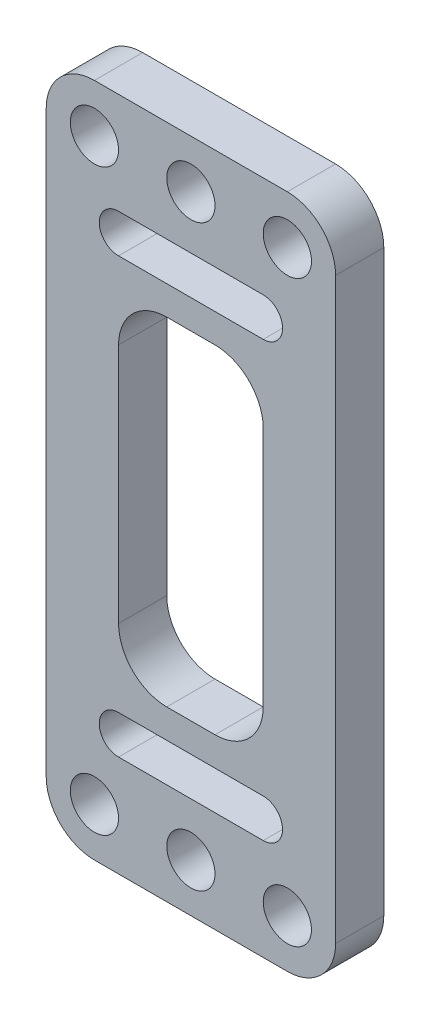
ISO-10303-21;
HEADER;
FILE_DESCRIPTION(('STEP AP214'),'2;1');
FILE_NAME('part.step','',(''),(''),'','','');
FILE_SCHEMA(('AUTOMOTIVE_DESIGN { 1 0 10303 214 1 1 1 1 }'));
ENDSEC;
DATA;
#1=APPLICATION_CONTEXT('core data for automotive mechanical design processes');
#2=APPLICATION_PROTOCOL_DEFINITION('international standard','automotive_design',2000,#1);
#3=PRODUCT_CONTEXT('',#1,'mechanical');
#4=PRODUCT('Part','Part','',(#3));
#5=PRODUCT_RELATED_PRODUCT_CATEGORY('part','',(#4));
#6=PRODUCT_DEFINITION_FORMATION('','',#4);
#7=PRODUCT_DEFINITION_CONTEXT('part definition',#1,'design');
#8=PRODUCT_DEFINITION('design','',#6,#7);
#9=PRODUCT_DEFINITION_SHAPE('','',#8);
#10=(LENGTH_UNIT() NAMED_UNIT(*) SI_UNIT(.MILLI.,.METRE.));
#11=(NAMED_UNIT(*) PLANE_ANGLE_UNIT() SI_UNIT($,.RADIAN.));
#12=(NAMED_UNIT(*) SI_UNIT($,.STERADIAN.) SOLID_ANGLE_UNIT());
#13=UNCERTAINTY_MEASURE_WITH_UNIT(LENGTH_MEASURE(1.E-05),#10,'distance_accuracy_value','');
#14=(GEOMETRIC_REPRESENTATION_CONTEXT(3) GLOBAL_UNCERTAINTY_ASSIGNED_CONTEXT((#13)) GLOBAL_UNIT_ASSIGNED_CONTEXT((#10,
#11,#12)) REPRESENTATION_CONTEXT('',''));
#15=CARTESIAN_POINT('',(0.,0.,0.));
#16=DIRECTION('',(0.,0.,1.));
#17=DIRECTION('',(1.,0.,0.));
#18=AXIS2_PLACEMENT_3D('',#15,#16,#17);
#19=CARTESIAN_POINT('',(0.,0.,5.));
#20=DIRECTION('',(0.,0.,-1.));
#21=DIRECTION('',(-1.,0.,0.));
#22=AXIS2_PLACEMENT_3D('',#19,#20,#21);
#23=PLANE('',#22);
#24=DIRECTION('',(1.,0.,0.));
#25=VECTOR('',#24,1.);
#26=CARTESIAN_POINT('',(-7.5,20.5,5.));
#27=LINE('',#26,#25);
#28=CARTESIAN_POINT('',(-7.5,20.5,5.));
#29=VERTEX_POINT('',#28);
#30=CARTESIAN_POINT('',(7.5,20.5,5.));
#31=VERTEX_POINT('',#30);
#32=EDGE_CURVE('E229',#29,#31,#27,.T.);
#33=ORIENTED_EDGE('',*,*,#32,.F.);
#34=CARTESIAN_POINT('',(-7.5,22.5,5.));
#35=DIRECTION('',(0.,0.,1.));
#36=DIRECTION('',(1.,0.,0.));
#37=AXIS2_PLACEMENT_3D('',#34,#35,#36);
#38=CIRCLE('',#37,2.00000000000001);
#39=CARTESIAN_POINT('',(-7.5,24.5,5.));
#40=VERTEX_POINT('',#39);
#41=EDGE_CURVE('E202',#40,#29,#38,.T.);
#42=ORIENTED_EDGE('',*,*,#41,.F.);
#43=DIRECTION('',(-1.,0.,0.));
#44=VECTOR('',#43,1.);
#45=CARTESIAN_POINT('',(-7.5,24.5,5.));
#46=LINE('',#45,#44);
#47=CARTESIAN_POINT('',(7.5,24.5,5.));
#48=VERTEX_POINT('',#47);
#49=EDGE_CURVE('E220',#48,#40,#46,.T.);
#50=ORIENTED_EDGE('',*,*,#49,.F.);
#51=CARTESIAN_POINT('',(7.5,22.5,5.));
#52=DIRECTION('',(0.,0.,1.));
#53=DIRECTION('',(1.,0.,0.));
#54=AXIS2_PLACEMENT_3D('',#51,#52,#53);
#55=CIRCLE('',#54,2.00000000000001);
#56=EDGE_CURVE('E223',#31,#48,#55,.T.);
#57=ORIENTED_EDGE('',*,*,#56,.F.);
#58=EDGE_LOOP('',(#33,#42,#50,#57));
#59=FACE_BOUND('',#58,.T.);
#60=DIRECTION('',(1.,0.,0.));
#61=VECTOR('',#60,1.);
#62=CARTESIAN_POINT('',(-7.50000000000001,-24.5,5.));
#63=LINE('',#62,#61);
#64=CARTESIAN_POINT('',(-7.50000000000001,-24.5,5.));
#65=VERTEX_POINT('',#64);
#66=CARTESIAN_POINT('',(7.49999999999999,-24.5,5.));
#67=VERTEX_POINT('',#66);
#68=EDGE_CURVE('E256',#65,#67,#63,.T.);
#69=ORIENTED_EDGE('',*,*,#68,.F.);
#70=CARTESIAN_POINT('',(-7.50000000000001,-22.5,5.));
#71=DIRECTION('',(0.,0.,1.));
#72=DIRECTION('',(-1.,0.,0.));
#73=AXIS2_PLACEMENT_3D('',#70,#71,#72);
#74=CIRCLE('',#73,2.00000000000001);
#75=CARTESIAN_POINT('',(-7.50000000000001,-20.5,5.));
#76=VERTEX_POINT('',#75);
#77=EDGE_CURVE('E254',#76,#65,#74,.T.);
#78=ORIENTED_EDGE('',*,*,#77,.F.);
#79=DIRECTION('',(-1.,0.,0.));
#80=VECTOR('',#79,1.);
#81=CARTESIAN_POINT('',(-7.50000000000001,-20.5,5.));
#82=LINE('',#81,#80);
#83=CARTESIAN_POINT('',(7.49999999999999,-20.5,5.));
#84=VERTEX_POINT('',#83);
#85=EDGE_CURVE('E244',#84,#76,#82,.T.);
#86=ORIENTED_EDGE('',*,*,#85,.F.);
#87=CARTESIAN_POINT('',(7.49999999999999,-22.5,5.));
#88=DIRECTION('',(0.,0.,1.));
#89=DIRECTION('',(-1.,0.,0.));
#90=AXIS2_PLACEMENT_3D('',#87,#88,#89);
#91=CIRCLE('',#90,2.00000000000001);
#92=EDGE_CURVE('E259',#67,#84,#91,.T.);
#93=ORIENTED_EDGE('',*,*,#92,.F.);
#94=EDGE_LOOP('',(#69,#78,#86,#93));
#95=FACE_BOUND('',#94,.T.);
#96=DIRECTION('',(-1.,0.,0.));
#97=VECTOR('',#96,1.);
#98=CARTESIAN_POINT('',(-7.5,17.5,5.));
#99=LINE('',#98,#97);
#100=CARTESIAN_POINT('',(2.5,17.5,5.));
#101=VERTEX_POINT('',#100);
#102=CARTESIAN_POINT('',(-2.5,17.5,5.));
#103=VERTEX_POINT('',#102);
#104=EDGE_CURVE('E285',#101,#103,#99,.T.);
#105=ORIENTED_EDGE('',*,*,#104,.F.);
#106=CARTESIAN_POINT('',(2.5,12.5,5.));
#107=DIRECTION('',(0.,0.,-1.));
#108=DIRECTION('',(-1.,0.,0.));
#109=AXIS2_PLACEMENT_3D('',#106,#107,#108);
#110=CIRCLE('',#109,5.);
#111=CARTESIAN_POINT('',(7.5,12.5,5.));
#112=VERTEX_POINT('',#111);
#113=EDGE_CURVE('E414',#101,#112,#110,.T.);
#114=ORIENTED_EDGE('',*,*,#113,.T.);
#115=DIRECTION('',(0.,1.,0.));
#116=VECTOR('',#115,1.);
#117=CARTESIAN_POINT('',(7.5,-17.5,5.));
#118=LINE('',#117,#116);
#119=CARTESIAN_POINT('',(7.5,-12.5,5.));
#120=VERTEX_POINT('',#119);
#121=EDGE_CURVE('E236',#120,#112,#118,.T.);
#122=ORIENTED_EDGE('',*,*,#121,.F.);
#123=CARTESIAN_POINT('',(2.5,-12.5,5.));
#124=DIRECTION('',(0.,0.,-1.));
#125=DIRECTION('',(-1.,0.,0.));
#126=AXIS2_PLACEMENT_3D('',#123,#124,#125);
#127=CIRCLE('',#126,5.);
#128=CARTESIAN_POINT('',(2.5,-17.5,5.));
#129=VERTEX_POINT('',#128);
#130=EDGE_CURVE('E406',#120,#129,#127,.T.);
#131=ORIENTED_EDGE('',*,*,#130,.T.);
#132=DIRECTION('',(1.,0.,0.));
#133=VECTOR('',#132,1.);
#134=CARTESIAN_POINT('',(-7.5,-17.5,5.));
#135=LINE('',#134,#133);
#136=CARTESIAN_POINT('',(-2.5,-17.5,5.));
#137=VERTEX_POINT('',#136);
#138=EDGE_CURVE('E274',#137,#129,#135,.T.);
#139=ORIENTED_EDGE('',*,*,#138,.F.);
#140=CARTESIAN_POINT('',(-2.5,-12.5,5.));
#141=DIRECTION('',(0.,0.,-1.));
#142=DIRECTION('',(-1.,0.,0.));
#143=AXIS2_PLACEMENT_3D('',#140,#141,#142);
#144=CIRCLE('',#143,5.);
#145=CARTESIAN_POINT('',(-7.5,-12.5,5.));
#146=VERTEX_POINT('',#145);
#147=EDGE_CURVE('E410',#137,#146,#144,.T.);
#148=ORIENTED_EDGE('',*,*,#147,.T.);
#149=DIRECTION('',(0.,-1.,0.));
#150=VECTOR('',#149,1.);
#151=CARTESIAN_POINT('',(-7.5,-17.5,5.));
#152=LINE('',#151,#150);
#153=CARTESIAN_POINT('',(-7.5,12.5,5.));
#154=VERTEX_POINT('',#153);
#155=EDGE_CURVE('E287',#154,#146,#152,.T.);
#156=ORIENTED_EDGE('',*,*,#155,.F.);
#157=CARTESIAN_POINT('',(-2.5,12.5,5.));
#158=DIRECTION('',(0.,0.,-1.));
#159=DIRECTION('',(-1.,0.,0.));
#160=AXIS2_PLACEMENT_3D('',#157,#158,#159);
#161=CIRCLE('',#160,5.);
#162=EDGE_CURVE('E41',#154,#103,#161,.T.);
#163=ORIENTED_EDGE('',*,*,#162,.T.);
#164=EDGE_LOOP('',(#105,#114,#122,#131,#139,#148,#156,#163));
#165=FACE_BOUND('',#164,.T.);
#166=DIRECTION('',(1.,0.,0.));
#167=VECTOR('',#166,1.);
#168=CARTESIAN_POINT('',(-15.,-35.,5.));
#169=LINE('',#168,#167);
#170=CARTESIAN_POINT('',(-10.,-35.,5.));
#171=VERTEX_POINT('',#170);
#172=CARTESIAN_POINT('',(9.99999999999998,-35.,5.));
#173=VERTEX_POINT('',#172);
#174=EDGE_CURVE('E338',#171,#173,#169,.T.);
#175=ORIENTED_EDGE('',*,*,#174,.T.);
#176=CARTESIAN_POINT('',(9.99999999999999,-30.,5.));
#177=DIRECTION('',(0.,0.,-1.));
#178=DIRECTION('',(-1.,0.,0.));
#179=AXIS2_PLACEMENT_3D('',#176,#177,#178);
#180=CIRCLE('',#179,5.);
#181=CARTESIAN_POINT('',(15.,-30.,5.));
#182=VERTEX_POINT('',#181);
#183=EDGE_CURVE('E375',#173,#182,#180,.F.);
#184=ORIENTED_EDGE('',*,*,#183,.T.);
#185=DIRECTION('',(0.,1.,0.));
#186=VECTOR('',#185,1.);
#187=CARTESIAN_POINT('',(15.,-35.,5.));
#188=LINE('',#187,#186);
#189=CARTESIAN_POINT('',(15.,30.,5.));
#190=VERTEX_POINT('',#189);
#191=EDGE_CURVE('E328',#182,#190,#188,.T.);
#192=ORIENTED_EDGE('',*,*,#191,.T.);
#193=CARTESIAN_POINT('',(9.99999999999999,30.,5.));
#194=DIRECTION('',(0.,0.,-1.));
#195=DIRECTION('',(-1.,0.,0.));
#196=AXIS2_PLACEMENT_3D('',#193,#194,#195);
#197=CIRCLE('',#196,5.);
#198=CARTESIAN_POINT('',(9.99999999999998,35.,5.));
#199=VERTEX_POINT('',#198);
#200=EDGE_CURVE('E371',#190,#199,#197,.F.);
#201=ORIENTED_EDGE('',*,*,#200,.T.);
#202=DIRECTION('',(-1.,0.,0.));
#203=VECTOR('',#202,1.);
#204=CARTESIAN_POINT('',(-15.,35.,5.));
#205=LINE('',#204,#203);
#206=CARTESIAN_POINT('',(-10.,35.,5.));
#207=VERTEX_POINT('',#206);
#208=EDGE_CURVE('E331',#199,#207,#205,.T.);
#209=ORIENTED_EDGE('',*,*,#208,.T.);
#210=CARTESIAN_POINT('',(-10.,30.,5.));
#211=DIRECTION('',(0.,0.,-1.));
#212=DIRECTION('',(-1.,0.,0.));
#213=AXIS2_PLACEMENT_3D('',#210,#211,#212);
#214=CIRCLE('',#213,5.);
#215=CARTESIAN_POINT('',(-15.,30.,5.));
#216=VERTEX_POINT('',#215);
#217=EDGE_CURVE('E369',#207,#216,#214,.F.);
#218=ORIENTED_EDGE('',*,*,#217,.T.);
#219=DIRECTION('',(0.,-1.,0.));
#220=VECTOR('',#219,1.);
#221=CARTESIAN_POINT('',(-15.,-35.,5.));
#222=LINE('',#221,#220);
#223=CARTESIAN_POINT('',(-15.,-30.,5.));
#224=VERTEX_POINT('',#223);
#225=EDGE_CURVE('E335',#216,#224,#222,.T.);
#226=ORIENTED_EDGE('',*,*,#225,.T.);
#227=CARTESIAN_POINT('',(-10.,-30.,5.));
#228=DIRECTION('',(0.,0.,-1.));
#229=DIRECTION('',(-1.,0.,0.));
#230=AXIS2_PLACEMENT_3D('',#227,#228,#229);
#231=CIRCLE('',#230,5.);
#232=EDGE_CURVE('E373',#224,#171,#231,.F.);
#233=ORIENTED_EDGE('',*,*,#232,.T.);
#234=EDGE_LOOP('',(#175,#184,#192,#201,#209,#218,#226,#233));
#235=FACE_BOUND('',#234,.T.);
#236=CARTESIAN_POINT('',(0.,30.,5.));
#237=DIRECTION('',(0.,0.,1.));
#238=DIRECTION('',(1.,0.,0.));
#239=AXIS2_PLACEMENT_3D('',#236,#237,#238);
#240=CIRCLE('',#239,2.5);
#241=CARTESIAN_POINT('',(2.49999999999999,30.,5.));
#242=VERTEX_POINT('',#241);
#243=EDGE_CURVE('E322',#242,#242,#240,.T.);
#244=ORIENTED_EDGE('',*,*,#243,.F.);
#245=EDGE_LOOP('',(#244));
#246=FACE_BOUND('',#245,.T.);
#247=CARTESIAN_POINT('',(9.99999999999999,30.,5.));
#248=DIRECTION('',(0.,0.,1.));
#249=DIRECTION('',(1.,0.,0.));
#250=AXIS2_PLACEMENT_3D('',#247,#248,#249);
#251=CIRCLE('',#250,2.5);
#252=CARTESIAN_POINT('',(12.5,30.,5.));
#253=VERTEX_POINT('',#252);
#254=EDGE_CURVE('E316',#253,#253,#251,.T.);
#255=ORIENTED_EDGE('',*,*,#254,.F.);
#256=EDGE_LOOP('',(#255));
#257=FACE_BOUND('',#256,.T.);
#258=CARTESIAN_POINT('',(-10.,30.,5.));
#259=DIRECTION('',(0.,0.,1.));
#260=DIRECTION('',(-1.,0.,0.));
#261=AXIS2_PLACEMENT_3D('',#258,#259,#260);
#262=CIRCLE('',#261,2.5);
#263=CARTESIAN_POINT('',(-12.5,30.,5.));
#264=VERTEX_POINT('',#263);
#265=EDGE_CURVE('E310',#264,#264,#262,.T.);
#266=ORIENTED_EDGE('',*,*,#265,.F.);
#267=EDGE_LOOP('',(#266));
#268=FACE_BOUND('',#267,.T.);
#269=CARTESIAN_POINT('',(9.99999999999999,-30.,5.));
#270=DIRECTION('',(0.,0.,1.));
#271=DIRECTION('',(-1.,0.,0.));
#272=AXIS2_PLACEMENT_3D('',#269,#270,#271);
#273=CIRCLE('',#272,2.5);
#274=CARTESIAN_POINT('',(7.49999999999999,-30.,5.));
#275=VERTEX_POINT('',#274);
#276=EDGE_CURVE('E304',#275,#275,#273,.T.);
#277=ORIENTED_EDGE('',*,*,#276,.F.);
#278=EDGE_LOOP('',(#277));
#279=FACE_BOUND('',#278,.T.);
#280=CARTESIAN_POINT('',(0.,-30.,5.));
#281=DIRECTION('',(0.,0.,1.));
#282=DIRECTION('',(-1.,0.,0.));
#283=AXIS2_PLACEMENT_3D('',#280,#281,#282);
#284=CIRCLE('',#283,2.5);
#285=CARTESIAN_POINT('',(-2.5,-30.,5.));
#286=VERTEX_POINT('',#285);
#287=EDGE_CURVE('E298',#286,#286,#284,.T.);
#288=ORIENTED_EDGE('',*,*,#287,.F.);
#289=EDGE_LOOP('',(#288));
#290=FACE_BOUND('',#289,.T.);
#291=CARTESIAN_POINT('',(-10.,-30.,5.));
#292=DIRECTION('',(0.,0.,1.));
#293=DIRECTION('',(1.,0.,0.));
#294=AXIS2_PLACEMENT_3D('',#291,#292,#293);
#295=CIRCLE('',#294,2.5);
#296=CARTESIAN_POINT('',(-7.5,-30.,5.));
#297=VERTEX_POINT('',#296);
#298=EDGE_CURVE('E292',#297,#297,#295,.T.);
#299=ORIENTED_EDGE('',*,*,#298,.F.);
#300=EDGE_LOOP('',(#299));
#301=FACE_BOUND('',#300,.T.);
#302=ADVANCED_FACE('F33',(#59,#95,#165,#235,#246,#257,#268,#279,#290,#301),#23,.F.);
#303=CARTESIAN_POINT('',(0.,0.,0.));
#304=DIRECTION('',(0.,0.,-1.));
#305=DIRECTION('',(-1.,0.,0.));
#306=AXIS2_PLACEMENT_3D('',#303,#304,#305);
#307=PLANE('',#306);
#308=CARTESIAN_POINT('',(-7.5,22.5,0.));
#309=DIRECTION('',(0.,0.,1.));
#310=DIRECTION('',(1.,0.,0.));
#311=AXIS2_PLACEMENT_3D('',#308,#309,#310);
#312=CIRCLE('',#311,2.00000000000001);
#313=CARTESIAN_POINT('',(-7.5,24.5,0.));
#314=VERTEX_POINT('',#313);
#315=CARTESIAN_POINT('',(-7.5,20.5,0.));
#316=VERTEX_POINT('',#315);
#317=EDGE_CURVE('E199',#314,#316,#312,.T.);
#318=ORIENTED_EDGE('',*,*,#317,.T.);
#319=DIRECTION('',(1.,0.,0.));
#320=VECTOR('',#319,1.);
#321=CARTESIAN_POINT('',(-7.5,20.5,0.));
#322=LINE('',#321,#320);
#323=CARTESIAN_POINT('',(7.5,20.5,0.));
#324=VERTEX_POINT('',#323);
#325=EDGE_CURVE('E211',#316,#324,#322,.T.);
#326=ORIENTED_EDGE('',*,*,#325,.T.);
#327=CARTESIAN_POINT('',(7.5,22.5,0.));
#328=DIRECTION('',(0.,0.,1.));
#329=DIRECTION('',(1.,0.,0.));
#330=AXIS2_PLACEMENT_3D('',#327,#328,#329);
#331=CIRCLE('',#330,2.00000000000001);
#332=CARTESIAN_POINT('',(7.5,24.5,0.));
#333=VERTEX_POINT('',#332);
#334=EDGE_CURVE('E215',#324,#333,#331,.T.);
#335=ORIENTED_EDGE('',*,*,#334,.T.);
#336=DIRECTION('',(-1.,0.,0.));
#337=VECTOR('',#336,1.);
#338=CARTESIAN_POINT('',(-7.5,24.5,0.));
#339=LINE('',#338,#337);
#340=EDGE_CURVE('E207',#333,#314,#339,.T.);
#341=ORIENTED_EDGE('',*,*,#340,.T.);
#342=EDGE_LOOP('',(#318,#326,#335,#341));
#343=FACE_BOUND('',#342,.T.);
#344=CARTESIAN_POINT('',(-7.50000000000001,-22.5,0.));
#345=DIRECTION('',(0.,0.,1.));
#346=DIRECTION('',(-1.,0.,0.));
#347=AXIS2_PLACEMENT_3D('',#344,#345,#346);
#348=CIRCLE('',#347,2.00000000000001);
#349=CARTESIAN_POINT('',(-7.50000000000001,-20.5,0.));
#350=VERTEX_POINT('',#349);
#351=CARTESIAN_POINT('',(-7.50000000000001,-24.5,0.));
#352=VERTEX_POINT('',#351);
#353=EDGE_CURVE('E240',#350,#352,#348,.T.);
#354=ORIENTED_EDGE('',*,*,#353,.T.);
#355=DIRECTION('',(1.,0.,0.));
#356=VECTOR('',#355,1.);
#357=CARTESIAN_POINT('',(-7.50000000000001,-24.5,0.));
#358=LINE('',#357,#356);
#359=CARTESIAN_POINT('',(7.49999999999999,-24.5,0.));
#360=VERTEX_POINT('',#359);
#361=EDGE_CURVE('E243',#352,#360,#358,.T.);
#362=ORIENTED_EDGE('',*,*,#361,.T.);
#363=CARTESIAN_POINT('',(7.49999999999999,-22.5,0.));
#364=DIRECTION('',(0.,0.,1.));
#365=DIRECTION('',(-1.,0.,0.));
#366=AXIS2_PLACEMENT_3D('',#363,#364,#365);
#367=CIRCLE('',#366,2.00000000000001);
#368=CARTESIAN_POINT('',(7.49999999999999,-20.5,0.));
#369=VERTEX_POINT('',#368);
#370=EDGE_CURVE('E247',#360,#369,#367,.T.);
#371=ORIENTED_EDGE('',*,*,#370,.T.);
#372=DIRECTION('',(-1.,0.,0.));
#373=VECTOR('',#372,1.);
#374=CARTESIAN_POINT('',(-7.50000000000001,-20.5,0.));
#375=LINE('',#374,#373);
#376=EDGE_CURVE('E250',#369,#350,#375,.T.);
#377=ORIENTED_EDGE('',*,*,#376,.T.);
#378=EDGE_LOOP('',(#354,#362,#371,#377));
#379=FACE_BOUND('',#378,.T.);
#380=DIRECTION('',(1.,0.,0.));
#381=VECTOR('',#380,1.);
#382=CARTESIAN_POINT('',(-7.5,-17.5,0.));
#383=LINE('',#382,#381);
#384=CARTESIAN_POINT('',(-2.5,-17.5,0.));
#385=VERTEX_POINT('',#384);
#386=CARTESIAN_POINT('',(2.5,-17.5,0.));
#387=VERTEX_POINT('',#386);
#388=EDGE_CURVE('E279',#385,#387,#383,.T.);
#389=ORIENTED_EDGE('',*,*,#388,.T.);
#390=CARTESIAN_POINT('',(2.5,-12.5,0.));
#391=DIRECTION('',(0.,0.,-1.));
#392=DIRECTION('',(-1.,0.,0.));
#393=AXIS2_PLACEMENT_3D('',#390,#391,#392);
#394=CIRCLE('',#393,5.);
#395=CARTESIAN_POINT('',(7.5,-12.5,0.));
#396=VERTEX_POINT('',#395);
#397=EDGE_CURVE('E408',#387,#396,#394,.F.);
#398=ORIENTED_EDGE('',*,*,#397,.T.);
#399=DIRECTION('',(0.,1.,0.));
#400=VECTOR('',#399,1.);
#401=CARTESIAN_POINT('',(7.5,-17.5,0.));
#402=LINE('',#401,#400);
#403=CARTESIAN_POINT('',(7.5,12.5,0.));
#404=VERTEX_POINT('',#403);
#405=EDGE_CURVE('E271',#396,#404,#402,.T.);
#406=ORIENTED_EDGE('',*,*,#405,.T.);
#407=CARTESIAN_POINT('',(2.5,12.5,0.));
#408=DIRECTION('',(0.,0.,-1.));
#409=DIRECTION('',(-1.,0.,0.));
#410=AXIS2_PLACEMENT_3D('',#407,#408,#409);
#411=CIRCLE('',#410,5.);
#412=CARTESIAN_POINT('',(2.5,17.5,0.));
#413=VERTEX_POINT('',#412);
#414=EDGE_CURVE('E55',#404,#413,#411,.F.);
#415=ORIENTED_EDGE('',*,*,#414,.T.);
#416=DIRECTION('',(-1.,0.,0.));
#417=VECTOR('',#416,1.);
#418=CARTESIAN_POINT('',(-7.5,17.5,0.));
#419=LINE('',#418,#417);
#420=CARTESIAN_POINT('',(-2.5,17.5,0.));
#421=VERTEX_POINT('',#420);
#422=EDGE_CURVE('E273',#413,#421,#419,.T.);
#423=ORIENTED_EDGE('',*,*,#422,.T.);
#424=CARTESIAN_POINT('',(-2.5,12.5,0.));
#425=DIRECTION('',(0.,0.,-1.));
#426=DIRECTION('',(-1.,0.,0.));
#427=AXIS2_PLACEMENT_3D('',#424,#425,#426);
#428=CIRCLE('',#427,5.);
#429=CARTESIAN_POINT('',(-7.5,12.5,0.));
#430=VERTEX_POINT('',#429);
#431=EDGE_CURVE('E11',#421,#430,#428,.F.);
#432=ORIENTED_EDGE('',*,*,#431,.T.);
#433=DIRECTION('',(0.,-1.,0.));
#434=VECTOR('',#433,1.);
#435=CARTESIAN_POINT('',(-7.5,-17.5,0.));
#436=LINE('',#435,#434);
#437=CARTESIAN_POINT('',(-7.5,-12.5,0.));
#438=VERTEX_POINT('',#437);
#439=EDGE_CURVE('E276',#430,#438,#436,.T.);
#440=ORIENTED_EDGE('',*,*,#439,.T.);
#441=CARTESIAN_POINT('',(-2.5,-12.5,0.));
#442=DIRECTION('',(0.,0.,-1.));
#443=DIRECTION('',(-1.,0.,0.));
#444=AXIS2_PLACEMENT_3D('',#441,#442,#443);
#445=CIRCLE('',#444,5.);
#446=EDGE_CURVE('E412',#438,#385,#445,.F.);
#447=ORIENTED_EDGE('',*,*,#446,.T.);
#448=EDGE_LOOP('',(#389,#398,#406,#415,#423,#432,#440,#447));
#449=FACE_BOUND('',#448,.T.);
#450=CARTESIAN_POINT('',(0.,-30.,0.));
#451=DIRECTION('',(0.,0.,1.));
#452=DIRECTION('',(-1.,0.,0.));
#453=AXIS2_PLACEMENT_3D('',#450,#451,#452);
#454=CIRCLE('',#453,2.5);
#455=CARTESIAN_POINT('',(-2.5,-30.,0.));
#456=VERTEX_POINT('',#455);
#457=EDGE_CURVE('E295',#456,#456,#454,.T.);
#458=ORIENTED_EDGE('',*,*,#457,.T.);
#459=EDGE_LOOP('',(#458));
#460=FACE_BOUND('',#459,.T.);
#461=CARTESIAN_POINT('',(-10.,30.,0.));
#462=DIRECTION('',(0.,0.,1.));
#463=DIRECTION('',(-1.,0.,0.));
#464=AXIS2_PLACEMENT_3D('',#461,#462,#463);
#465=CIRCLE('',#464,2.5);
#466=CARTESIAN_POINT('',(-12.5,30.,0.));
#467=VERTEX_POINT('',#466);
#468=EDGE_CURVE('E307',#467,#467,#465,.T.);
#469=ORIENTED_EDGE('',*,*,#468,.T.);
#470=EDGE_LOOP('',(#469));
#471=FACE_BOUND('',#470,.T.);
#472=CARTESIAN_POINT('',(0.,30.,0.));
#473=DIRECTION('',(0.,0.,1.));
#474=DIRECTION('',(1.,0.,0.));
#475=AXIS2_PLACEMENT_3D('',#472,#473,#474);
#476=CIRCLE('',#475,2.5);
#477=CARTESIAN_POINT('',(2.49999999999999,30.,0.));
#478=VERTEX_POINT('',#477);
#479=EDGE_CURVE('E319',#478,#478,#476,.T.);
#480=ORIENTED_EDGE('',*,*,#479,.T.);
#481=EDGE_LOOP('',(#480));
#482=FACE_BOUND('',#481,.T.);
#483=DIRECTION('',(0.,1.,0.));
#484=VECTOR('',#483,1.);
#485=CARTESIAN_POINT('',(15.,-35.,0.));
#486=LINE('',#485,#484);
#487=CARTESIAN_POINT('',(15.,-30.,0.));
#488=VERTEX_POINT('',#487);
#489=CARTESIAN_POINT('',(15.,30.,0.));
#490=VERTEX_POINT('',#489);
#491=EDGE_CURVE('E325',#488,#490,#486,.T.);
#492=ORIENTED_EDGE('',*,*,#491,.F.);
#493=CARTESIAN_POINT('',(9.99999999999999,-30.,0.));
#494=DIRECTION('',(0.,0.,-1.));
#495=DIRECTION('',(-1.,0.,0.));
#496=AXIS2_PLACEMENT_3D('',#493,#494,#495);
#497=CIRCLE('',#496,5.);
#498=CARTESIAN_POINT('',(9.99999999999998,-35.,0.));
#499=VERTEX_POINT('',#498);
#500=EDGE_CURVE('E362',#488,#499,#497,.T.);
#501=ORIENTED_EDGE('',*,*,#500,.T.);
#502=DIRECTION('',(1.,0.,0.));
#503=VECTOR('',#502,1.);
#504=CARTESIAN_POINT('',(-15.,-35.,0.));
#505=LINE('',#504,#503);
#506=CARTESIAN_POINT('',(-10.,-35.,0.));
#507=VERTEX_POINT('',#506);
#508=EDGE_CURVE('E332',#507,#499,#505,.T.);
#509=ORIENTED_EDGE('',*,*,#508,.F.);
#510=CARTESIAN_POINT('',(-10.,-30.,0.));
#511=DIRECTION('',(0.,0.,-1.));
#512=DIRECTION('',(-1.,0.,0.));
#513=AXIS2_PLACEMENT_3D('',#510,#511,#512);
#514=CIRCLE('',#513,5.);
#515=CARTESIAN_POINT('',(-15.,-30.,0.));
#516=VERTEX_POINT('',#515);
#517=EDGE_CURVE('E360',#507,#516,#514,.T.);
#518=ORIENTED_EDGE('',*,*,#517,.T.);
#519=DIRECTION('',(0.,-1.,0.));
#520=VECTOR('',#519,1.);
#521=CARTESIAN_POINT('',(-15.,-35.,0.));
#522=LINE('',#521,#520);
#523=CARTESIAN_POINT('',(-15.,30.,0.));
#524=VERTEX_POINT('',#523);
#525=EDGE_CURVE('E347',#524,#516,#522,.T.);
#526=ORIENTED_EDGE('',*,*,#525,.F.);
#527=CARTESIAN_POINT('',(-10.,30.,0.));
#528=DIRECTION('',(0.,0.,-1.));
#529=DIRECTION('',(-1.,0.,0.));
#530=AXIS2_PLACEMENT_3D('',#527,#528,#529);
#531=CIRCLE('',#530,5.);
#532=CARTESIAN_POINT('',(-10.,35.,0.));
#533=VERTEX_POINT('',#532);
#534=EDGE_CURVE('E356',#524,#533,#531,.T.);
#535=ORIENTED_EDGE('',*,*,#534,.T.);
#536=DIRECTION('',(-1.,0.,0.));
#537=VECTOR('',#536,1.);
#538=CARTESIAN_POINT('',(-15.,35.,0.));
#539=LINE('',#538,#537);
#540=CARTESIAN_POINT('',(9.99999999999998,35.,0.));
#541=VERTEX_POINT('',#540);
#542=EDGE_CURVE('E344',#541,#533,#539,.T.);
#543=ORIENTED_EDGE('',*,*,#542,.F.);
#544=CARTESIAN_POINT('',(9.99999999999999,30.,0.));
#545=DIRECTION('',(0.,0.,-1.));
#546=DIRECTION('',(-1.,0.,0.));
#547=AXIS2_PLACEMENT_3D('',#544,#545,#546);
#548=CIRCLE('',#547,5.);
#549=EDGE_CURVE('E358',#541,#490,#548,.T.);
#550=ORIENTED_EDGE('',*,*,#549,.T.);
#551=EDGE_LOOP('',(#492,#501,#509,#518,#526,#535,#543,#550));
#552=FACE_BOUND('',#551,.T.);
#553=CARTESIAN_POINT('',(9.99999999999999,30.,0.));
#554=DIRECTION('',(0.,0.,1.));
#555=DIRECTION('',(1.,0.,0.));
#556=AXIS2_PLACEMENT_3D('',#553,#554,#555);
#557=CIRCLE('',#556,2.5);
#558=CARTESIAN_POINT('',(12.5,30.,0.));
#559=VERTEX_POINT('',#558);
#560=EDGE_CURVE('E313',#559,#559,#557,.T.);
#561=ORIENTED_EDGE('',*,*,#560,.T.);
#562=EDGE_LOOP('',(#561));
#563=FACE_BOUND('',#562,.T.);
#564=CARTESIAN_POINT('',(9.99999999999999,-30.,0.));
#565=DIRECTION('',(0.,0.,1.));
#566=DIRECTION('',(-1.,0.,0.));
#567=AXIS2_PLACEMENT_3D('',#564,#565,#566);
#568=CIRCLE('',#567,2.5);
#569=CARTESIAN_POINT('',(7.49999999999999,-30.,0.));
#570=VERTEX_POINT('',#569);
#571=EDGE_CURVE('E301',#570,#570,#568,.T.);
#572=ORIENTED_EDGE('',*,*,#571,.T.);
#573=EDGE_LOOP('',(#572));
#574=FACE_BOUND('',#573,.T.);
#575=CARTESIAN_POINT('',(-10.,-30.,0.));
#576=DIRECTION('',(0.,0.,1.));
#577=DIRECTION('',(1.,0.,0.));
#578=AXIS2_PLACEMENT_3D('',#575,#576,#577);
#579=CIRCLE('',#578,2.5);
#580=CARTESIAN_POINT('',(-7.5,-30.,0.));
#581=VERTEX_POINT('',#580);
#582=EDGE_CURVE('E282',#581,#581,#579,.T.);
#583=ORIENTED_EDGE('',*,*,#582,.T.);
#584=EDGE_LOOP('',(#583));
#585=FACE_BOUND('',#584,.T.);
#586=ADVANCED_FACE('F217',(#343,#379,#449,#460,#471,#482,#552,#563,#574,#585),#307,.T.);
#587=CARTESIAN_POINT('',(15.,-35.,5.));
#588=DIRECTION('',(-1.,0.,0.));
#589=DIRECTION('',(0.,0.,1.));
#590=AXIS2_PLACEMENT_3D('',#587,#588,#589);
#591=PLANE('',#590);
#592=ORIENTED_EDGE('',*,*,#191,.F.);
#593=DIRECTION('',(0.,0.,-1.));
#594=VECTOR('',#593,1.);
#595=CARTESIAN_POINT('',(15.,-30.,5.));
#596=LINE('',#595,#594);
#597=EDGE_CURVE('E353',#182,#488,#596,.T.);
#598=ORIENTED_EDGE('',*,*,#597,.T.);
#599=ORIENTED_EDGE('',*,*,#491,.T.);
#600=DIRECTION('',(0.,0.,-1.));
#601=VECTOR('',#600,1.);
#602=CARTESIAN_POINT('',(15.,30.,5.));
#603=LINE('',#602,#601);
#604=EDGE_CURVE('E341',#490,#190,#603,.F.);
#605=ORIENTED_EDGE('',*,*,#604,.T.);
#606=EDGE_LOOP('',(#592,#598,#599,#605));
#607=FACE_BOUND('',#606,.T.);
#608=ADVANCED_FACE('F462',(#607),#591,.F.);
#609=CARTESIAN_POINT('',(-15.,35.,5.));
#610=DIRECTION('',(0.,-1.,0.));
#611=DIRECTION('',(0.,0.,-1.));
#612=AXIS2_PLACEMENT_3D('',#609,#610,#611);
#613=PLANE('',#612);
#614=ORIENTED_EDGE('',*,*,#208,.F.);
#615=DIRECTION('',(0.,0.,-1.));
#616=VECTOR('',#615,1.);
#617=CARTESIAN_POINT('',(9.99999999999999,35.,5.));
#618=LINE('',#617,#616);
#619=EDGE_CURVE('E384',#199,#541,#618,.T.);
#620=ORIENTED_EDGE('',*,*,#619,.T.);
#621=ORIENTED_EDGE('',*,*,#542,.T.);
#622=DIRECTION('',(0.,0.,-1.));
#623=VECTOR('',#622,1.);
#624=CARTESIAN_POINT('',(-10.,35.,5.));
#625=LINE('',#624,#623);
#626=EDGE_CURVE('E382',#533,#207,#625,.F.);
#627=ORIENTED_EDGE('',*,*,#626,.T.);
#628=EDGE_LOOP('',(#614,#620,#621,#627));
#629=FACE_BOUND('',#628,.T.);
#630=ADVANCED_FACE('F476',(#629),#613,.F.);
#631=CARTESIAN_POINT('',(-15.,-35.,5.));
#632=DIRECTION('',(1.,0.,0.));
#633=DIRECTION('',(0.,0.,-1.));
#634=AXIS2_PLACEMENT_3D('',#631,#632,#633);
#635=PLANE('',#634);
#636=ORIENTED_EDGE('',*,*,#525,.T.);
#637=DIRECTION('',(0.,0.,-1.));
#638=VECTOR('',#637,1.);
#639=CARTESIAN_POINT('',(-15.,-30.,5.));
#640=LINE('',#639,#638);
#641=EDGE_CURVE('E380',#516,#224,#640,.F.);
#642=ORIENTED_EDGE('',*,*,#641,.T.);
#643=ORIENTED_EDGE('',*,*,#225,.F.);
#644=DIRECTION('',(0.,0.,-1.));
#645=VECTOR('',#644,1.);
#646=CARTESIAN_POINT('',(-15.,30.,5.));
#647=LINE('',#646,#645);
#648=EDGE_CURVE('E377',#216,#524,#647,.T.);
#649=ORIENTED_EDGE('',*,*,#648,.T.);
#650=EDGE_LOOP('',(#636,#642,#643,#649));
#651=FACE_BOUND('',#650,.T.);
#652=ADVANCED_FACE('F472',(#651),#635,.F.);
#653=CARTESIAN_POINT('',(-15.,-35.,5.));
#654=DIRECTION('',(0.,1.,0.));
#655=DIRECTION('',(0.,0.,1.));
#656=AXIS2_PLACEMENT_3D('',#653,#654,#655);
#657=PLANE('',#656);
#658=ORIENTED_EDGE('',*,*,#508,.T.);
#659=DIRECTION('',(0.,0.,-1.));
#660=VECTOR('',#659,1.);
#661=CARTESIAN_POINT('',(9.99999999999999,-35.,5.));
#662=LINE('',#661,#660);
#663=EDGE_CURVE('E367',#499,#173,#662,.F.);
#664=ORIENTED_EDGE('',*,*,#663,.T.);
#665=ORIENTED_EDGE('',*,*,#174,.F.);
#666=DIRECTION('',(0.,0.,-1.));
#667=VECTOR('',#666,1.);
#668=CARTESIAN_POINT('',(-10.,-35.,5.));
#669=LINE('',#668,#667);
#670=EDGE_CURVE('E364',#171,#507,#669,.T.);
#671=ORIENTED_EDGE('',*,*,#670,.T.);
#672=EDGE_LOOP('',(#658,#664,#665,#671));
#673=FACE_BOUND('',#672,.T.);
#674=ADVANCED_FACE('F469',(#673),#657,.F.);
#675=CARTESIAN_POINT('',(0.,30.,5.));
#676=DIRECTION('',(0.,0.,-1.));
#677=DIRECTION('',(-1.,0.,0.));
#678=AXIS2_PLACEMENT_3D('',#675,#676,#677);
#679=CYLINDRICAL_SURFACE('',#678,2.5);
#680=ORIENTED_EDGE('',*,*,#243,.T.);
#681=EDGE_LOOP('',(#680));
#682=FACE_BOUND('',#681,.T.);
#683=ORIENTED_EDGE('',*,*,#479,.F.);
#684=EDGE_LOOP('',(#683));
#685=FACE_BOUND('',#684,.T.);
#686=ADVANCED_FACE('F466',(#682,#685),#679,.F.);
#687=CARTESIAN_POINT('',(9.99999999999999,30.,5.));
#688=DIRECTION('',(0.,0.,-1.));
#689=DIRECTION('',(-1.,0.,0.));
#690=AXIS2_PLACEMENT_3D('',#687,#688,#689);
#691=CYLINDRICAL_SURFACE('',#690,2.5);
#692=ORIENTED_EDGE('',*,*,#254,.T.);
#693=EDGE_LOOP('',(#692));
#694=FACE_BOUND('',#693,.T.);
#695=ORIENTED_EDGE('',*,*,#560,.F.);
#696=EDGE_LOOP('',(#695));
#697=FACE_BOUND('',#696,.T.);
#698=ADVANCED_FACE('F554',(#694,#697),#691,.F.);
#699=CARTESIAN_POINT('',(-10.,30.,5.));
#700=DIRECTION('',(0.,0.,-1.));
#701=DIRECTION('',(-1.,0.,0.));
#702=AXIS2_PLACEMENT_3D('',#699,#700,#701);
#703=CYLINDRICAL_SURFACE('',#702,2.5);
#704=ORIENTED_EDGE('',*,*,#265,.T.);
#705=EDGE_LOOP('',(#704));
#706=FACE_BOUND('',#705,.T.);
#707=ORIENTED_EDGE('',*,*,#468,.F.);
#708=EDGE_LOOP('',(#707));
#709=FACE_BOUND('',#708,.T.);
#710=ADVANCED_FACE('F551',(#706,#709),#703,.F.);
#711=CARTESIAN_POINT('',(9.99999999999999,-30.,5.));
#712=DIRECTION('',(0.,0.,-1.));
#713=DIRECTION('',(-1.,0.,0.));
#714=AXIS2_PLACEMENT_3D('',#711,#712,#713);
#715=CYLINDRICAL_SURFACE('',#714,2.5);
#716=ORIENTED_EDGE('',*,*,#276,.T.);
#717=EDGE_LOOP('',(#716));
#718=FACE_BOUND('',#717,.T.);
#719=ORIENTED_EDGE('',*,*,#571,.F.);
#720=EDGE_LOOP('',(#719));
#721=FACE_BOUND('',#720,.T.);
#722=ADVANCED_FACE('F547',(#718,#721),#715,.F.);
#723=CARTESIAN_POINT('',(0.,-30.,5.));
#724=DIRECTION('',(0.,0.,-1.));
#725=DIRECTION('',(-1.,0.,0.));
#726=AXIS2_PLACEMENT_3D('',#723,#724,#725);
#727=CYLINDRICAL_SURFACE('',#726,2.5);
#728=ORIENTED_EDGE('',*,*,#287,.T.);
#729=EDGE_LOOP('',(#728));
#730=FACE_BOUND('',#729,.T.);
#731=ORIENTED_EDGE('',*,*,#457,.F.);
#732=EDGE_LOOP('',(#731));
#733=FACE_BOUND('',#732,.T.);
#734=ADVANCED_FACE('F543',(#730,#733),#727,.F.);
#735=CARTESIAN_POINT('',(-10.,-30.,5.));
#736=DIRECTION('',(0.,0.,-1.));
#737=DIRECTION('',(-1.,0.,0.));
#738=AXIS2_PLACEMENT_3D('',#735,#736,#737);
#739=CYLINDRICAL_SURFACE('',#738,2.5);
#740=ORIENTED_EDGE('',*,*,#298,.T.);
#741=EDGE_LOOP('',(#740));
#742=FACE_BOUND('',#741,.T.);
#743=ORIENTED_EDGE('',*,*,#582,.F.);
#744=EDGE_LOOP('',(#743));
#745=FACE_BOUND('',#744,.T.);
#746=ADVANCED_FACE('F488',(#742,#745),#739,.F.);
#747=CARTESIAN_POINT('',(9.99999999999999,-30.,5.));
#748=DIRECTION('',(0.,0.,-1.));
#749=DIRECTION('',(-1.,0.,0.));
#750=AXIS2_PLACEMENT_3D('',#747,#748,#749);
#751=CYLINDRICAL_SURFACE('',#750,5.);
#752=ORIENTED_EDGE('',*,*,#183,.F.);
#753=ORIENTED_EDGE('',*,*,#663,.F.);
#754=ORIENTED_EDGE('',*,*,#500,.F.);
#755=ORIENTED_EDGE('',*,*,#597,.F.);
#756=EDGE_LOOP('',(#752,#753,#754,#755));
#757=FACE_BOUND('',#756,.T.);
#758=ADVANCED_FACE('F484',(#757),#751,.T.);
#759=CARTESIAN_POINT('',(-10.,-30.,5.));
#760=DIRECTION('',(0.,0.,-1.));
#761=DIRECTION('',(-1.,0.,0.));
#762=AXIS2_PLACEMENT_3D('',#759,#760,#761);
#763=CYLINDRICAL_SURFACE('',#762,5.);
#764=ORIENTED_EDGE('',*,*,#232,.F.);
#765=ORIENTED_EDGE('',*,*,#641,.F.);
#766=ORIENTED_EDGE('',*,*,#517,.F.);
#767=ORIENTED_EDGE('',*,*,#670,.F.);
#768=EDGE_LOOP('',(#764,#765,#766,#767));
#769=FACE_BOUND('',#768,.T.);
#770=ADVANCED_FACE('F487',(#769),#763,.T.);
#771=CARTESIAN_POINT('',(9.99999999999999,30.,5.));
#772=DIRECTION('',(0.,0.,-1.));
#773=DIRECTION('',(-1.,0.,0.));
#774=AXIS2_PLACEMENT_3D('',#771,#772,#773);
#775=CYLINDRICAL_SURFACE('',#774,5.);
#776=ORIENTED_EDGE('',*,*,#200,.F.);
#777=ORIENTED_EDGE('',*,*,#604,.F.);
#778=ORIENTED_EDGE('',*,*,#549,.F.);
#779=ORIENTED_EDGE('',*,*,#619,.F.);
#780=EDGE_LOOP('',(#776,#777,#778,#779));
#781=FACE_BOUND('',#780,.T.);
#782=ADVANCED_FACE('F492',(#781),#775,.T.);
#783=CARTESIAN_POINT('',(-10.,30.,5.));
#784=DIRECTION('',(0.,0.,-1.));
#785=DIRECTION('',(-1.,0.,0.));
#786=AXIS2_PLACEMENT_3D('',#783,#784,#785);
#787=CYLINDRICAL_SURFACE('',#786,5.);
#788=ORIENTED_EDGE('',*,*,#217,.F.);
#789=ORIENTED_EDGE('',*,*,#626,.F.);
#790=ORIENTED_EDGE('',*,*,#534,.F.);
#791=ORIENTED_EDGE('',*,*,#648,.F.);
#792=EDGE_LOOP('',(#788,#789,#790,#791));
#793=FACE_BOUND('',#792,.T.);
#794=ADVANCED_FACE('F496',(#793),#787,.T.);
#795=CARTESIAN_POINT('',(7.5,-17.5,0.));
#796=DIRECTION('',(1.,0.,0.));
#797=DIRECTION('',(0.,0.,-1.));
#798=AXIS2_PLACEMENT_3D('',#795,#796,#797);
#799=PLANE('',#798);
#800=ORIENTED_EDGE('',*,*,#405,.F.);
#801=DIRECTION('',(0.,0.,1.));
#802=VECTOR('',#801,1.);
#803=CARTESIAN_POINT('',(7.5,-12.5,5.));
#804=LINE('',#803,#802);
#805=EDGE_CURVE('E389',#396,#120,#804,.T.);
#806=ORIENTED_EDGE('',*,*,#805,.T.);
#807=ORIENTED_EDGE('',*,*,#121,.T.);
#808=DIRECTION('',(0.,0.,1.));
#809=VECTOR('',#808,1.);
#810=CARTESIAN_POINT('',(7.5,12.5,0.));
#811=LINE('',#810,#809);
#812=EDGE_CURVE('E387',#112,#404,#811,.F.);
#813=ORIENTED_EDGE('',*,*,#812,.T.);
#814=EDGE_LOOP('',(#800,#806,#807,#813));
#815=FACE_BOUND('',#814,.T.);
#816=ADVANCED_FACE('F445',(#815),#799,.F.);
#817=CARTESIAN_POINT('',(-7.5,-17.5,0.));
#818=DIRECTION('',(0.,-1.,0.));
#819=DIRECTION('',(0.,0.,-1.));
#820=AXIS2_PLACEMENT_3D('',#817,#818,#819);
#821=PLANE('',#820);
#822=ORIENTED_EDGE('',*,*,#138,.T.);
#823=DIRECTION('',(0.,0.,1.));
#824=VECTOR('',#823,1.);
#825=CARTESIAN_POINT('',(2.5,-17.5,0.));
#826=LINE('',#825,#824);
#827=EDGE_CURVE('E395',#129,#387,#826,.F.);
#828=ORIENTED_EDGE('',*,*,#827,.T.);
#829=ORIENTED_EDGE('',*,*,#388,.F.);
#830=DIRECTION('',(0.,0.,1.));
#831=VECTOR('',#830,1.);
#832=CARTESIAN_POINT('',(-2.5,-17.5,5.));
#833=LINE('',#832,#831);
#834=EDGE_CURVE('E392',#385,#137,#833,.T.);
#835=ORIENTED_EDGE('',*,*,#834,.T.);
#836=EDGE_LOOP('',(#822,#828,#829,#835));
#837=FACE_BOUND('',#836,.T.);
#838=ADVANCED_FACE('F437',(#837),#821,.F.);
#839=CARTESIAN_POINT('',(-7.5,-17.5,0.));
#840=DIRECTION('',(-1.,0.,0.));
#841=DIRECTION('',(0.,0.,1.));
#842=AXIS2_PLACEMENT_3D('',#839,#840,#841);
#843=PLANE('',#842);
#844=ORIENTED_EDGE('',*,*,#155,.T.);
#845=DIRECTION('',(0.,0.,1.));
#846=VECTOR('',#845,1.);
#847=CARTESIAN_POINT('',(-7.5,-12.5,0.));
#848=LINE('',#847,#846);
#849=EDGE_CURVE('E400',#146,#438,#848,.F.);
#850=ORIENTED_EDGE('',*,*,#849,.T.);
#851=ORIENTED_EDGE('',*,*,#439,.F.);
#852=DIRECTION('',(0.,0.,1.));
#853=VECTOR('',#852,1.);
#854=CARTESIAN_POINT('',(-7.5,12.5,5.));
#855=LINE('',#854,#853);
#856=EDGE_CURVE('E397',#430,#154,#855,.T.);
#857=ORIENTED_EDGE('',*,*,#856,.T.);
#858=EDGE_LOOP('',(#844,#850,#851,#857));
#859=FACE_BOUND('',#858,.T.);
#860=ADVANCED_FACE('F429',(#859),#843,.F.);
#861=CARTESIAN_POINT('',(-7.5,17.5,0.));
#862=DIRECTION('',(0.,1.,0.));
#863=DIRECTION('',(0.,0.,1.));
#864=AXIS2_PLACEMENT_3D('',#861,#862,#863);
#865=PLANE('',#864);
#866=ORIENTED_EDGE('',*,*,#422,.F.);
#867=DIRECTION('',(0.,0.,1.));
#868=VECTOR('',#867,1.);
#869=CARTESIAN_POINT('',(2.5,17.5,5.));
#870=LINE('',#869,#868);
#871=EDGE_CURVE('E403',#413,#101,#870,.T.);
#872=ORIENTED_EDGE('',*,*,#871,.T.);
#873=ORIENTED_EDGE('',*,*,#104,.T.);
#874=DIRECTION('',(0.,0.,1.));
#875=VECTOR('',#874,1.);
#876=CARTESIAN_POINT('',(-2.5,17.5,0.));
#877=LINE('',#876,#875);
#878=EDGE_CURVE('E48',#103,#421,#877,.F.);
#879=ORIENTED_EDGE('',*,*,#878,.T.);
#880=EDGE_LOOP('',(#866,#872,#873,#879));
#881=FACE_BOUND('',#880,.T.);
#882=ADVANCED_FACE('F422',(#881),#865,.F.);
#883=CARTESIAN_POINT('',(-7.50000000000001,-22.5,0.));
#884=DIRECTION('',(0.,0.,1.));
#885=DIRECTION('',(1.,0.,0.));
#886=AXIS2_PLACEMENT_3D('',#883,#884,#885);
#887=CYLINDRICAL_SURFACE('',#886,2.00000000000001);
#888=ORIENTED_EDGE('',*,*,#77,.T.);
#889=DIRECTION('',(0.,0.,1.));
#890=VECTOR('',#889,1.);
#891=CARTESIAN_POINT('',(-7.50000000000001,-24.5,0.));
#892=LINE('',#891,#890);
#893=EDGE_CURVE('E253',#352,#65,#892,.T.);
#894=ORIENTED_EDGE('',*,*,#893,.F.);
#895=ORIENTED_EDGE('',*,*,#353,.F.);
#896=DIRECTION('',(0.,0.,1.));
#897=VECTOR('',#896,1.);
#898=CARTESIAN_POINT('',(-7.50000000000001,-20.5,0.));
#899=LINE('',#898,#897);
#900=EDGE_CURVE('E230',#350,#76,#899,.T.);
#901=ORIENTED_EDGE('',*,*,#900,.T.);
#902=EDGE_LOOP('',(#888,#894,#895,#901));
#903=FACE_BOUND('',#902,.T.);
#904=ADVANCED_FACE('F522',(#903),#887,.F.);
#905=CARTESIAN_POINT('',(-7.50000000000001,-20.5,0.));
#906=DIRECTION('',(0.,1.,0.));
#907=DIRECTION('',(-1.,0.,0.));
#908=AXIS2_PLACEMENT_3D('',#905,#906,#907);
#909=PLANE('',#908);
#910=ORIENTED_EDGE('',*,*,#85,.T.);
#911=ORIENTED_EDGE('',*,*,#900,.F.);
#912=ORIENTED_EDGE('',*,*,#376,.F.);
#913=DIRECTION('',(0.,0.,1.));
#914=VECTOR('',#913,1.);
#915=CARTESIAN_POINT('',(7.49999999999999,-20.5,0.));
#916=LINE('',#915,#914);
#917=EDGE_CURVE('E265',#369,#84,#916,.T.);
#918=ORIENTED_EDGE('',*,*,#917,.T.);
#919=EDGE_LOOP('',(#910,#911,#912,#918));
#920=FACE_BOUND('',#919,.T.);
#921=ADVANCED_FACE('F518',(#920),#909,.F.);
#922=CARTESIAN_POINT('',(7.49999999999999,-22.5,0.));
#923=DIRECTION('',(0.,0.,1.));
#924=DIRECTION('',(1.,0.,0.));
#925=AXIS2_PLACEMENT_3D('',#922,#923,#924);
#926=CYLINDRICAL_SURFACE('',#925,2.00000000000001);
#927=ORIENTED_EDGE('',*,*,#92,.T.);
#928=ORIENTED_EDGE('',*,*,#917,.F.);
#929=ORIENTED_EDGE('',*,*,#370,.F.);
#930=DIRECTION('',(0.,0.,1.));
#931=VECTOR('',#930,1.);
#932=CARTESIAN_POINT('',(7.49999999999999,-24.5,0.));
#933=LINE('',#932,#931);
#934=EDGE_CURVE('E267',#360,#67,#933,.T.);
#935=ORIENTED_EDGE('',*,*,#934,.T.);
#936=EDGE_LOOP('',(#927,#928,#929,#935));
#937=FACE_BOUND('',#936,.T.);
#938=ADVANCED_FACE('F521',(#937),#926,.F.);
#939=CARTESIAN_POINT('',(-7.50000000000001,-24.5,0.));
#940=DIRECTION('',(0.,-1.,0.));
#941=DIRECTION('',(1.,0.,0.));
#942=AXIS2_PLACEMENT_3D('',#939,#940,#941);
#943=PLANE('',#942);
#944=ORIENTED_EDGE('',*,*,#68,.T.);
#945=ORIENTED_EDGE('',*,*,#934,.F.);
#946=ORIENTED_EDGE('',*,*,#361,.F.);
#947=ORIENTED_EDGE('',*,*,#893,.T.);
#948=EDGE_LOOP('',(#944,#945,#946,#947));
#949=FACE_BOUND('',#948,.T.);
#950=ADVANCED_FACE('F517',(#949),#943,.F.);
#951=CARTESIAN_POINT('',(-7.5,22.5,0.));
#952=DIRECTION('',(0.,0.,1.));
#953=DIRECTION('',(1.,0.,0.));
#954=AXIS2_PLACEMENT_3D('',#951,#952,#953);
#955=CYLINDRICAL_SURFACE('',#954,2.00000000000001);
#956=ORIENTED_EDGE('',*,*,#41,.T.);
#957=DIRECTION('',(0.,0.,1.));
#958=VECTOR('',#957,1.);
#959=CARTESIAN_POINT('',(-7.5,20.5,0.));
#960=LINE('',#959,#958);
#961=EDGE_CURVE('E195',#316,#29,#960,.T.);
#962=ORIENTED_EDGE('',*,*,#961,.F.);
#963=ORIENTED_EDGE('',*,*,#317,.F.);
#964=DIRECTION('',(0.,0.,1.));
#965=VECTOR('',#964,1.);
#966=CARTESIAN_POINT('',(-7.5,24.5,0.));
#967=LINE('',#966,#965);
#968=EDGE_CURVE('E234',#314,#40,#967,.T.);
#969=ORIENTED_EDGE('',*,*,#968,.T.);
#970=EDGE_LOOP('',(#956,#962,#963,#969));
#971=FACE_BOUND('',#970,.T.);
#972=ADVANCED_FACE('F197',(#971),#955,.F.);
#973=CARTESIAN_POINT('',(-7.5,24.5,0.));
#974=DIRECTION('',(0.,1.,0.));
#975=DIRECTION('',(-1.,0.,0.));
#976=AXIS2_PLACEMENT_3D('',#973,#974,#975);
#977=PLANE('',#976);
#978=ORIENTED_EDGE('',*,*,#49,.T.);
#979=ORIENTED_EDGE('',*,*,#968,.F.);
#980=ORIENTED_EDGE('',*,*,#340,.F.);
#981=DIRECTION('',(0.,0.,1.));
#982=VECTOR('',#981,1.);
#983=CARTESIAN_POINT('',(7.5,24.5,0.));
#984=LINE('',#983,#982);
#985=EDGE_CURVE('E237',#333,#48,#984,.T.);
#986=ORIENTED_EDGE('',*,*,#985,.T.);
#987=EDGE_LOOP('',(#978,#979,#980,#986));
#988=FACE_BOUND('',#987,.T.);
#989=ADVANCED_FACE('F510',(#988),#977,.F.);
#990=CARTESIAN_POINT('',(7.5,22.5,0.));
#991=DIRECTION('',(0.,0.,1.));
#992=DIRECTION('',(1.,0.,0.));
#993=AXIS2_PLACEMENT_3D('',#990,#991,#992);
#994=CYLINDRICAL_SURFACE('',#993,2.00000000000001);
#995=ORIENTED_EDGE('',*,*,#56,.T.);
#996=ORIENTED_EDGE('',*,*,#985,.F.);
#997=ORIENTED_EDGE('',*,*,#334,.F.);
#998=DIRECTION('',(0.,0.,1.));
#999=VECTOR('',#998,1.);
#1000=CARTESIAN_POINT('',(7.5,20.5,0.));
#1001=LINE('',#1000,#999);
#1002=EDGE_CURVE('E206',#324,#31,#1001,.T.);
#1003=ORIENTED_EDGE('',*,*,#1002,.T.);
#1004=EDGE_LOOP('',(#995,#996,#997,#1003));
#1005=FACE_BOUND('',#1004,.T.);
#1006=ADVANCED_FACE('F505',(#1005),#994,.F.);
#1007=CARTESIAN_POINT('',(-7.5,20.5,0.));
#1008=DIRECTION('',(0.,-1.,0.));
#1009=DIRECTION('',(0.,0.,-1.));
#1010=AXIS2_PLACEMENT_3D('',#1007,#1008,#1009);
#1011=PLANE('',#1010);
#1012=ORIENTED_EDGE('',*,*,#32,.T.);
#1013=ORIENTED_EDGE('',*,*,#1002,.F.);
#1014=ORIENTED_EDGE('',*,*,#325,.F.);
#1015=ORIENTED_EDGE('',*,*,#961,.T.);
#1016=EDGE_LOOP('',(#1012,#1013,#1014,#1015));
#1017=FACE_BOUND('',#1016,.T.);
#1018=ADVANCED_FACE('F212',(#1017),#1011,.F.);
#1019=CARTESIAN_POINT('',(2.5,-12.5,0.));
#1020=DIRECTION('',(0.,0.,-1.));
#1021=DIRECTION('',(-1.,0.,0.));
#1022=AXIS2_PLACEMENT_3D('',#1019,#1020,#1021);
#1023=CYLINDRICAL_SURFACE('',#1022,5.);
#1024=ORIENTED_EDGE('',*,*,#397,.F.);
#1025=ORIENTED_EDGE('',*,*,#827,.F.);
#1026=ORIENTED_EDGE('',*,*,#130,.F.);
#1027=ORIENTED_EDGE('',*,*,#805,.F.);
#1028=EDGE_LOOP('',(#1024,#1025,#1026,#1027));
#1029=FACE_BOUND('',#1028,.T.);
#1030=ADVANCED_FACE('F441',(#1029),#1023,.F.);
#1031=CARTESIAN_POINT('',(-2.5,-12.5,0.));
#1032=DIRECTION('',(0.,0.,-1.));
#1033=DIRECTION('',(-1.,0.,0.));
#1034=AXIS2_PLACEMENT_3D('',#1031,#1032,#1033);
#1035=CYLINDRICAL_SURFACE('',#1034,5.);
#1036=ORIENTED_EDGE('',*,*,#446,.F.);
#1037=ORIENTED_EDGE('',*,*,#849,.F.);
#1038=ORIENTED_EDGE('',*,*,#147,.F.);
#1039=ORIENTED_EDGE('',*,*,#834,.F.);
#1040=EDGE_LOOP('',(#1036,#1037,#1038,#1039));
#1041=FACE_BOUND('',#1040,.T.);
#1042=ADVANCED_FACE('F432',(#1041),#1035,.F.);
#1043=CARTESIAN_POINT('',(2.5,12.5,0.));
#1044=DIRECTION('',(0.,0.,-1.));
#1045=DIRECTION('',(-1.,0.,0.));
#1046=AXIS2_PLACEMENT_3D('',#1043,#1044,#1045);
#1047=CYLINDRICAL_SURFACE('',#1046,5.);
#1048=ORIENTED_EDGE('',*,*,#414,.F.);
#1049=ORIENTED_EDGE('',*,*,#812,.F.);
#1050=ORIENTED_EDGE('',*,*,#113,.F.);
#1051=ORIENTED_EDGE('',*,*,#871,.F.);
#1052=EDGE_LOOP('',(#1048,#1049,#1050,#1051));
#1053=FACE_BOUND('',#1052,.T.);
#1054=ADVANCED_FACE('F449',(#1053),#1047,.F.);
#1055=CARTESIAN_POINT('',(-2.5,12.5,0.));
#1056=DIRECTION('',(0.,0.,-1.));
#1057=DIRECTION('',(-1.,0.,0.));
#1058=AXIS2_PLACEMENT_3D('',#1055,#1056,#1057);
#1059=CYLINDRICAL_SURFACE('',#1058,5.);
#1060=ORIENTED_EDGE('',*,*,#431,.F.);
#1061=ORIENTED_EDGE('',*,*,#878,.F.);
#1062=ORIENTED_EDGE('',*,*,#162,.F.);
#1063=ORIENTED_EDGE('',*,*,#856,.F.);
#1064=EDGE_LOOP('',(#1060,#1061,#1062,#1063));
#1065=FACE_BOUND('',#1064,.T.);
#1066=ADVANCED_FACE('F35',(#1065),#1059,.F.);
#1067=CLOSED_SHELL('',(#302,#586,#608,#630,#652,#674,#686,#698,#710,#722,#734,#746,#758,#770,
#782,#794,#816,#838,#860,#882,#904,#921,#938,#950,#972,#989,#1006,#1018,#1030,#1042,#1054,#1066));
#1068=MANIFOLD_SOLID_BREP('B2',#1067);
#1069=ADVANCED_BREP_SHAPE_REPRESENTATION('',(#18,#1068),#14);
#1070=SHAPE_DEFINITION_REPRESENTATION(#9,#1069);
ENDSEC;
END-ISO-10303-21;
